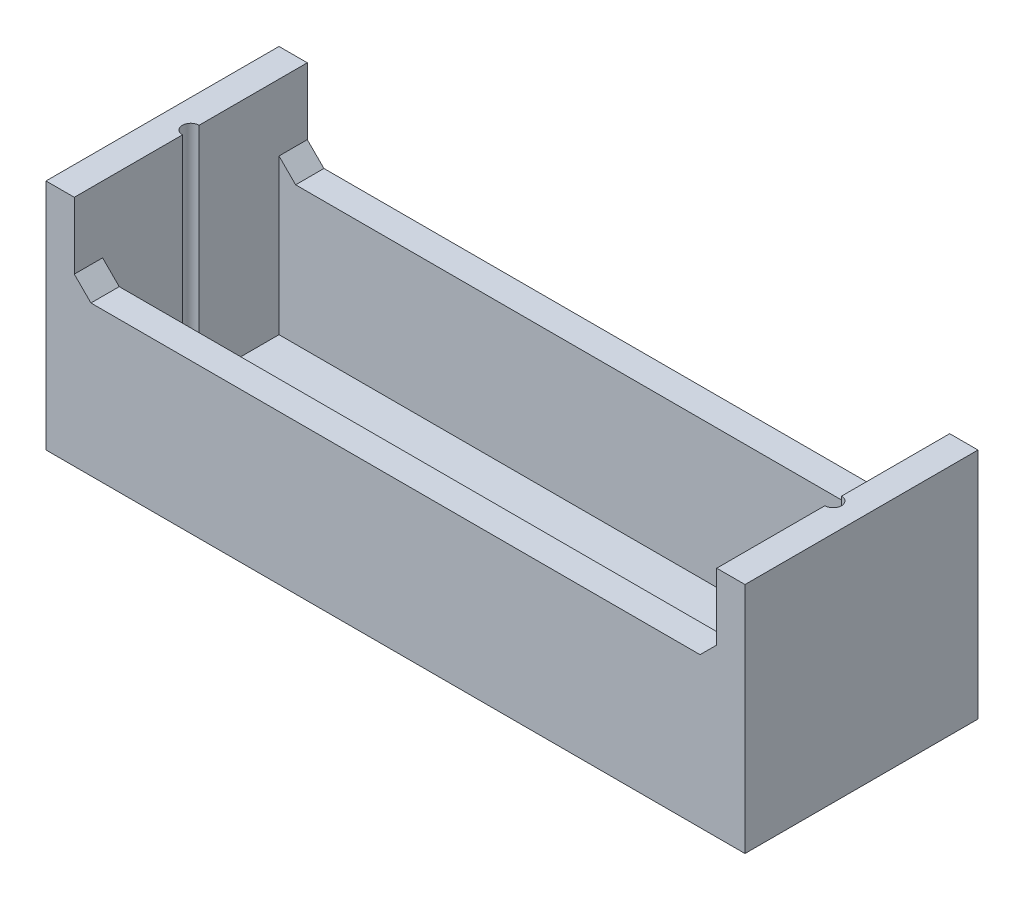
ISO-10303-21;
HEADER;
FILE_DESCRIPTION(('STEP AP214'),'2;1');
FILE_NAME('part.step','',(''),(''),'','','');
FILE_SCHEMA(('AUTOMOTIVE_DESIGN { 1 0 10303 214 1 1 1 1 }'));
ENDSEC;
DATA;
#1=APPLICATION_CONTEXT('core data for automotive mechanical design processes');
#2=APPLICATION_PROTOCOL_DEFINITION('international standard','automotive_design',2000,#1);
#3=PRODUCT_CONTEXT('',#1,'mechanical');
#4=PRODUCT('Part','Part','',(#3));
#5=PRODUCT_RELATED_PRODUCT_CATEGORY('part','',(#4));
#6=PRODUCT_DEFINITION_FORMATION('','',#4);
#7=PRODUCT_DEFINITION_CONTEXT('part definition',#1,'design');
#8=PRODUCT_DEFINITION('design','',#6,#7);
#9=PRODUCT_DEFINITION_SHAPE('','',#8);
#10=(LENGTH_UNIT() NAMED_UNIT(*) SI_UNIT(.MILLI.,.METRE.));
#11=(NAMED_UNIT(*) PLANE_ANGLE_UNIT() SI_UNIT($,.RADIAN.));
#12=(NAMED_UNIT(*) SI_UNIT($,.STERADIAN.) SOLID_ANGLE_UNIT());
#13=UNCERTAINTY_MEASURE_WITH_UNIT(LENGTH_MEASURE(1.E-05),#10,'distance_accuracy_value','');
#14=(GEOMETRIC_REPRESENTATION_CONTEXT(3) GLOBAL_UNCERTAINTY_ASSIGNED_CONTEXT((#13)) GLOBAL_UNIT_ASSIGNED_CONTEXT((#10,
#11,#12)) REPRESENTATION_CONTEXT('',''));
#15=CARTESIAN_POINT('',(0.,0.,0.));
#16=DIRECTION('',(0.,0.,1.));
#17=DIRECTION('',(1.,0.,0.));
#18=AXIS2_PLACEMENT_3D('',#15,#16,#17);
#19=CARTESIAN_POINT('',(-0.3,10.,2.));
#20=DIRECTION('',(1.,0.,0.));
#21=DIRECTION('',(0.,0.,-1.));
#22=AXIS2_PLACEMENT_3D('',#19,#20,#21);
#23=PLANE('',#22);
#24=DIRECTION('',(0.,-1.,0.));
#25=VECTOR('',#24,1.);
#26=CARTESIAN_POINT('',(-0.3,10.,-10.3));
#27=LINE('',#26,#25);
#28=CARTESIAN_POINT('',(-0.3,11.,-10.3));
#29=VERTEX_POINT('',#28);
#30=CARTESIAN_POINT('',(-0.3,1.7,-10.3));
#31=VERTEX_POINT('',#30);
#32=EDGE_CURVE('E274',#29,#31,#27,.T.);
#33=ORIENTED_EDGE('',*,*,#32,.F.);
#34=DIRECTION('',(0.,0.,-1.));
#35=VECTOR('',#34,1.);
#36=CARTESIAN_POINT('',(-0.3,11.,2.));
#37=LINE('',#36,#35);
#38=CARTESIAN_POINT('',(-0.3,11.,-12.));
#39=VERTEX_POINT('',#38);
#40=EDGE_CURVE('E344',#29,#39,#37,.T.);
#41=ORIENTED_EDGE('',*,*,#40,.T.);
#42=DIRECTION('',(0.,-1.,0.));
#43=VECTOR('',#42,1.);
#44=CARTESIAN_POINT('',(-0.3,15.,-12.));
#45=LINE('',#44,#43);
#46=CARTESIAN_POINT('',(-0.3,15.,-12.));
#47=VERTEX_POINT('',#46);
#48=EDGE_CURVE('E254',#47,#39,#45,.T.);
#49=ORIENTED_EDGE('',*,*,#48,.F.);
#50=DIRECTION('',(0.,0.,-1.));
#51=VECTOR('',#50,1.);
#52=CARTESIAN_POINT('',(-0.3,15.,-12.));
#53=LINE('',#52,#51);
#54=CARTESIAN_POINT('',(-0.299999999999999,15.,-5.5));
#55=VERTEX_POINT('',#54);
#56=EDGE_CURVE('E245',#55,#47,#53,.T.);
#57=ORIENTED_EDGE('',*,*,#56,.F.);
#58=DIRECTION('',(0.,1.,0.));
#59=VECTOR('',#58,1.);
#60=CARTESIAN_POINT('',(-0.3,0.285786437626903,-5.5));
#61=LINE('',#60,#59);
#62=CARTESIAN_POINT('',(-0.3,1.7,-5.5));
#63=VERTEX_POINT('',#62);
#64=EDGE_CURVE('E436',#63,#55,#61,.T.);
#65=ORIENTED_EDGE('',*,*,#64,.F.);
#66=DIRECTION('',(0.,0.,1.));
#67=VECTOR('',#66,1.);
#68=CARTESIAN_POINT('',(-0.3,1.7,0.));
#69=LINE('',#68,#67);
#70=EDGE_CURVE('E263',#31,#63,#69,.T.);
#71=ORIENTED_EDGE('',*,*,#70,.F.);
#72=EDGE_LOOP('',(#33,#41,#49,#57,#65,#71));
#73=FACE_BOUND('',#72,.T.);
#74=ADVANCED_FACE('F40',(#73),#23,.T.);
#75=CARTESIAN_POINT('',(38.3,10.,2.));
#76=DIRECTION('',(-1.,0.,0.));
#77=DIRECTION('',(0.,0.,1.));
#78=AXIS2_PLACEMENT_3D('',#75,#76,#77);
#79=PLANE('',#78);
#80=DIRECTION('',(0.,-1.,0.));
#81=VECTOR('',#80,1.);
#82=CARTESIAN_POINT('',(38.3,10.,0.3));
#83=LINE('',#82,#81);
#84=CARTESIAN_POINT('',(38.3,11.,0.3));
#85=VERTEX_POINT('',#84);
#86=CARTESIAN_POINT('',(38.3,1.7,0.3));
#87=VERTEX_POINT('',#86);
#88=EDGE_CURVE('E273',#85,#87,#83,.T.);
#89=ORIENTED_EDGE('',*,*,#88,.F.);
#90=DIRECTION('',(0.,0.,1.));
#91=VECTOR('',#90,1.);
#92=CARTESIAN_POINT('',(38.3,11.,2.));
#93=LINE('',#92,#91);
#94=CARTESIAN_POINT('',(38.3,11.,2.));
#95=VERTEX_POINT('',#94);
#96=EDGE_CURVE('E324',#85,#95,#93,.T.);
#97=ORIENTED_EDGE('',*,*,#96,.T.);
#98=DIRECTION('',(0.,-1.,0.));
#99=VECTOR('',#98,1.);
#100=CARTESIAN_POINT('',(38.3,15.,2.));
#101=LINE('',#100,#99);
#102=CARTESIAN_POINT('',(38.3,15.,2.));
#103=VERTEX_POINT('',#102);
#104=EDGE_CURVE('E227',#103,#95,#101,.T.);
#105=ORIENTED_EDGE('',*,*,#104,.F.);
#106=DIRECTION('',(0.,0.,1.));
#107=VECTOR('',#106,1.);
#108=CARTESIAN_POINT('',(38.3,15.,-12.));
#109=LINE('',#108,#107);
#110=CARTESIAN_POINT('',(38.3,15.,-4.5));
#111=VERTEX_POINT('',#110);
#112=EDGE_CURVE('E222',#111,#103,#109,.T.);
#113=ORIENTED_EDGE('',*,*,#112,.F.);
#114=DIRECTION('',(0.,1.,0.));
#115=VECTOR('',#114,1.);
#116=CARTESIAN_POINT('',(38.3,0.285786437626903,-4.5));
#117=LINE('',#116,#115);
#118=CARTESIAN_POINT('',(38.3,1.7,-4.5));
#119=VERTEX_POINT('',#118);
#120=EDGE_CURVE('E197',#119,#111,#117,.T.);
#121=ORIENTED_EDGE('',*,*,#120,.F.);
#122=DIRECTION('',(0.,0.,-1.));
#123=VECTOR('',#122,1.);
#124=CARTESIAN_POINT('',(38.3,1.7,0.));
#125=LINE('',#124,#123);
#126=EDGE_CURVE('E285',#87,#119,#125,.T.);
#127=ORIENTED_EDGE('',*,*,#126,.F.);
#128=EDGE_LOOP('',(#89,#97,#105,#113,#121,#127));
#129=FACE_BOUND('',#128,.T.);
#130=ADVANCED_FACE('F495',(#129),#79,.T.);
#131=CARTESIAN_POINT('',(0.,10.,0.));
#132=DIRECTION('',(0.,-1.,0.));
#133=DIRECTION('',(0.,0.,-1.));
#134=AXIS2_PLACEMENT_3D('',#131,#132,#133);
#135=PLANE('',#134);
#136=DIRECTION('',(-1.,0.,0.));
#137=VECTOR('',#136,1.);
#138=CARTESIAN_POINT('',(0.,10.,-10.3));
#139=LINE('',#138,#137);
#140=CARTESIAN_POINT('',(37.3,10.,-10.3));
#141=VERTEX_POINT('',#140);
#142=CARTESIAN_POINT('',(0.699999999999987,10.,-10.3));
#143=VERTEX_POINT('',#142);
#144=EDGE_CURVE('E279',#141,#143,#139,.T.);
#145=ORIENTED_EDGE('',*,*,#144,.F.);
#146=DIRECTION('',(0.,0.,-1.));
#147=VECTOR('',#146,1.);
#148=CARTESIAN_POINT('',(37.3,10.,0.));
#149=LINE('',#148,#147);
#150=CARTESIAN_POINT('',(37.3,10.,-12.));
#151=VERTEX_POINT('',#150);
#152=EDGE_CURVE('E341',#141,#151,#149,.T.);
#153=ORIENTED_EDGE('',*,*,#152,.T.);
#154=DIRECTION('',(-1.,0.,0.));
#155=VECTOR('',#154,1.);
#156=CARTESIAN_POINT('',(-2.,10.,-12.));
#157=LINE('',#156,#155);
#158=CARTESIAN_POINT('',(0.699999999999986,10.,-12.));
#159=VERTEX_POINT('',#158);
#160=EDGE_CURVE('E304',#151,#159,#157,.T.);
#161=ORIENTED_EDGE('',*,*,#160,.T.);
#162=DIRECTION('',(0.,0.,1.));
#163=VECTOR('',#162,1.);
#164=CARTESIAN_POINT('',(0.699999999999987,10.,0.));
#165=LINE('',#164,#163);
#166=EDGE_CURVE('E338',#159,#143,#165,.T.);
#167=ORIENTED_EDGE('',*,*,#166,.T.);
#168=EDGE_LOOP('',(#145,#153,#161,#167));
#169=FACE_BOUND('',#168,.T.);
#170=ADVANCED_FACE('F518',(#169),#135,.F.);
#171=DIRECTION('',(1.,0.,0.));
#172=VECTOR('',#171,1.);
#173=CARTESIAN_POINT('',(-2.,10.,2.));
#174=LINE('',#173,#172);
#175=CARTESIAN_POINT('',(0.699999999999986,10.,2.));
#176=VERTEX_POINT('',#175);
#177=CARTESIAN_POINT('',(37.3,10.,2.));
#178=VERTEX_POINT('',#177);
#179=EDGE_CURVE('E272',#176,#178,#174,.T.);
#180=ORIENTED_EDGE('',*,*,#179,.T.);
#181=DIRECTION('',(0.,0.,-1.));
#182=VECTOR('',#181,1.);
#183=CARTESIAN_POINT('',(37.3,10.,0.));
#184=LINE('',#183,#182);
#185=CARTESIAN_POINT('',(37.3,10.,0.3));
#186=VERTEX_POINT('',#185);
#187=EDGE_CURVE('E331',#178,#186,#184,.T.);
#188=ORIENTED_EDGE('',*,*,#187,.T.);
#189=DIRECTION('',(1.,0.,0.));
#190=VECTOR('',#189,1.);
#191=CARTESIAN_POINT('',(0.,10.,0.3));
#192=LINE('',#191,#190);
#193=CARTESIAN_POINT('',(0.699999999999987,10.,0.3));
#194=VERTEX_POINT('',#193);
#195=EDGE_CURVE('E294',#194,#186,#192,.T.);
#196=ORIENTED_EDGE('',*,*,#195,.F.);
#197=DIRECTION('',(0.,0.,1.));
#198=VECTOR('',#197,1.);
#199=CARTESIAN_POINT('',(0.699999999999987,10.,0.));
#200=LINE('',#199,#198);
#201=EDGE_CURVE('E328',#194,#176,#200,.T.);
#202=ORIENTED_EDGE('',*,*,#201,.T.);
#203=EDGE_LOOP('',(#180,#188,#196,#202));
#204=FACE_BOUND('',#203,.T.);
#205=ADVANCED_FACE('F488',(#204),#135,.F.);
#206=CARTESIAN_POINT('',(-2.,10.,2.));
#207=DIRECTION('',(1.,0.,0.));
#208=DIRECTION('',(0.,0.,-1.));
#209=AXIS2_PLACEMENT_3D('',#206,#207,#208);
#210=PLANE('',#209);
#211=DIRECTION('',(0.,-1.,0.));
#212=VECTOR('',#211,1.);
#213=CARTESIAN_POINT('',(-2.,10.,-12.));
#214=LINE('',#213,#212);
#215=CARTESIAN_POINT('',(-2.,15.,-12.));
#216=VERTEX_POINT('',#215);
#217=CARTESIAN_POINT('',(-2.,1.,-12.));
#218=VERTEX_POINT('',#217);
#219=EDGE_CURVE('E308',#216,#218,#214,.T.);
#220=ORIENTED_EDGE('',*,*,#219,.T.);
#221=DIRECTION('',(0.,0.,1.));
#222=VECTOR('',#221,1.);
#223=CARTESIAN_POINT('',(-2.,1.,2.));
#224=LINE('',#223,#222);
#225=CARTESIAN_POINT('',(-2.,1.,2.));
#226=VERTEX_POINT('',#225);
#227=EDGE_CURVE('E11',#218,#226,#224,.T.);
#228=ORIENTED_EDGE('',*,*,#227,.T.);
#229=DIRECTION('',(0.,-1.,0.));
#230=VECTOR('',#229,1.);
#231=CARTESIAN_POINT('',(-2.,10.,2.));
#232=LINE('',#231,#230);
#233=CARTESIAN_POINT('',(-2.,15.,2.));
#234=VERTEX_POINT('',#233);
#235=EDGE_CURVE('E317',#234,#226,#232,.T.);
#236=ORIENTED_EDGE('',*,*,#235,.F.);
#237=DIRECTION('',(0.,0.,1.));
#238=VECTOR('',#237,1.);
#239=CARTESIAN_POINT('',(-2.,15.,-12.));
#240=LINE('',#239,#238);
#241=EDGE_CURVE('E238',#216,#234,#240,.T.);
#242=ORIENTED_EDGE('',*,*,#241,.F.);
#243=EDGE_LOOP('',(#220,#228,#236,#242));
#244=FACE_BOUND('',#243,.T.);
#245=ADVANCED_FACE('F474',(#244),#210,.F.);
#246=CARTESIAN_POINT('',(-2.,10.,2.));
#247=DIRECTION('',(0.,0.,-1.));
#248=DIRECTION('',(-1.,0.,0.));
#249=AXIS2_PLACEMENT_3D('',#246,#247,#248);
#250=PLANE('',#249);
#251=ORIENTED_EDGE('',*,*,#235,.T.);
#252=DIRECTION('',(1.,0.,0.));
#253=VECTOR('',#252,1.);
#254=CARTESIAN_POINT('',(40.,1.,2.));
#255=LINE('',#254,#253);
#256=CARTESIAN_POINT('',(40.,1.,2.));
#257=VERTEX_POINT('',#256);
#258=EDGE_CURVE('E378',#226,#257,#255,.T.);
#259=ORIENTED_EDGE('',*,*,#258,.T.);
#260=DIRECTION('',(0.,-1.,0.));
#261=VECTOR('',#260,1.);
#262=CARTESIAN_POINT('',(40.,10.,2.));
#263=LINE('',#262,#261);
#264=CARTESIAN_POINT('',(40.,15.,2.));
#265=VERTEX_POINT('',#264);
#266=EDGE_CURVE('E314',#265,#257,#263,.T.);
#267=ORIENTED_EDGE('',*,*,#266,.F.);
#268=DIRECTION('',(1.,0.,0.));
#269=VECTOR('',#268,1.);
#270=CARTESIAN_POINT('',(40.,15.,2.));
#271=LINE('',#270,#269);
#272=EDGE_CURVE('E221',#103,#265,#271,.T.);
#273=ORIENTED_EDGE('',*,*,#272,.F.);
#274=ORIENTED_EDGE('',*,*,#104,.T.);
#275=DIRECTION('',(-0.707106781186543,-0.707106781186552,0.));
#276=VECTOR('',#275,1.);
#277=CARTESIAN_POINT('',(17.6500000000003,-9.65000000000001,2.));
#278=LINE('',#277,#276);
#279=EDGE_CURVE('E352',#95,#178,#278,.T.);
#280=ORIENTED_EDGE('',*,*,#279,.T.);
#281=ORIENTED_EDGE('',*,*,#179,.F.);
#282=DIRECTION('',(-0.707106781186543,0.707106781186552,0.));
#283=VECTOR('',#282,1.);
#284=CARTESIAN_POINT('',(-0.649999999999988,11.35,2.));
#285=LINE('',#284,#283);
#286=CARTESIAN_POINT('',(-0.299999999999998,11.,2.));
#287=VERTEX_POINT('',#286);
#288=EDGE_CURVE('E375',#176,#287,#285,.T.);
#289=ORIENTED_EDGE('',*,*,#288,.T.);
#290=DIRECTION('',(0.,-1.,0.));
#291=VECTOR('',#290,1.);
#292=CARTESIAN_POINT('',(-0.299999999999998,15.,2.));
#293=LINE('',#292,#291);
#294=CARTESIAN_POINT('',(-0.299999999999998,15.,2.));
#295=VERTEX_POINT('',#294);
#296=EDGE_CURVE('E258',#295,#287,#293,.T.);
#297=ORIENTED_EDGE('',*,*,#296,.F.);
#298=DIRECTION('',(1.,0.,0.));
#299=VECTOR('',#298,1.);
#300=CARTESIAN_POINT('',(-2.,15.,2.));
#301=LINE('',#300,#299);
#302=EDGE_CURVE('E242',#234,#295,#301,.T.);
#303=ORIENTED_EDGE('',*,*,#302,.F.);
#304=EDGE_LOOP('',(#251,#259,#267,#273,#274,#280,#281,#289,#297,#303));
#305=FACE_BOUND('',#304,.T.);
#306=ADVANCED_FACE('F429',(#305),#250,.F.);
#307=CARTESIAN_POINT('',(40.,10.,2.));
#308=DIRECTION('',(-1.,0.,0.));
#309=DIRECTION('',(0.,0.,1.));
#310=AXIS2_PLACEMENT_3D('',#307,#308,#309);
#311=PLANE('',#310);
#312=ORIENTED_EDGE('',*,*,#266,.T.);
#313=DIRECTION('',(0.,0.,-1.));
#314=VECTOR('',#313,1.);
#315=CARTESIAN_POINT('',(40.,1.,-12.));
#316=LINE('',#315,#314);
#317=CARTESIAN_POINT('',(40.,1.,-12.));
#318=VERTEX_POINT('',#317);
#319=EDGE_CURVE('E66',#257,#318,#316,.T.);
#320=ORIENTED_EDGE('',*,*,#319,.T.);
#321=DIRECTION('',(0.,-1.,0.));
#322=VECTOR('',#321,1.);
#323=CARTESIAN_POINT('',(40.,10.,-12.));
#324=LINE('',#323,#322);
#325=CARTESIAN_POINT('',(40.,15.,-12.));
#326=VERTEX_POINT('',#325);
#327=EDGE_CURVE('E311',#326,#318,#324,.T.);
#328=ORIENTED_EDGE('',*,*,#327,.F.);
#329=DIRECTION('',(0.,0.,-1.));
#330=VECTOR('',#329,1.);
#331=CARTESIAN_POINT('',(40.,15.,-12.));
#332=LINE('',#331,#330);
#333=EDGE_CURVE('E434',#265,#326,#332,.T.);
#334=ORIENTED_EDGE('',*,*,#333,.F.);
#335=EDGE_LOOP('',(#312,#320,#328,#334));
#336=FACE_BOUND('',#335,.T.);
#337=ADVANCED_FACE('F433',(#336),#311,.F.);
#338=CARTESIAN_POINT('',(-2.,10.,-12.));
#339=DIRECTION('',(0.,0.,1.));
#340=DIRECTION('',(1.,0.,0.));
#341=AXIS2_PLACEMENT_3D('',#338,#339,#340);
#342=PLANE('',#341);
#343=ORIENTED_EDGE('',*,*,#327,.T.);
#344=DIRECTION('',(-1.,0.,0.));
#345=VECTOR('',#344,1.);
#346=CARTESIAN_POINT('',(-2.,1.,-12.));
#347=LINE('',#346,#345);
#348=EDGE_CURVE('E51',#318,#218,#347,.T.);
#349=ORIENTED_EDGE('',*,*,#348,.T.);
#350=ORIENTED_EDGE('',*,*,#219,.F.);
#351=DIRECTION('',(-1.,0.,0.));
#352=VECTOR('',#351,1.);
#353=CARTESIAN_POINT('',(-2.,15.,-12.));
#354=LINE('',#353,#352);
#355=EDGE_CURVE('E250',#47,#216,#354,.T.);
#356=ORIENTED_EDGE('',*,*,#355,.F.);
#357=ORIENTED_EDGE('',*,*,#48,.T.);
#358=DIRECTION('',(0.707106781186543,-0.707106781186552,0.));
#359=VECTOR('',#358,1.);
#360=CARTESIAN_POINT('',(-0.649999999999988,11.35,-12.));
#361=LINE('',#360,#359);
#362=EDGE_CURVE('E365',#39,#159,#361,.T.);
#363=ORIENTED_EDGE('',*,*,#362,.T.);
#364=ORIENTED_EDGE('',*,*,#160,.F.);
#365=DIRECTION('',(0.707106781186543,0.707106781186552,0.));
#366=VECTOR('',#365,1.);
#367=CARTESIAN_POINT('',(17.6500000000003,-9.65000000000001,-12.));
#368=LINE('',#367,#366);
#369=CARTESIAN_POINT('',(38.3,11.,-12.));
#370=VERTEX_POINT('',#369);
#371=EDGE_CURVE('E362',#151,#370,#368,.T.);
#372=ORIENTED_EDGE('',*,*,#371,.T.);
#373=DIRECTION('',(0.,-1.,0.));
#374=VECTOR('',#373,1.);
#375=CARTESIAN_POINT('',(38.3,15.,-12.));
#376=LINE('',#375,#374);
#377=CARTESIAN_POINT('',(38.3,15.,-12.));
#378=VERTEX_POINT('',#377);
#379=EDGE_CURVE('E235',#378,#370,#376,.T.);
#380=ORIENTED_EDGE('',*,*,#379,.F.);
#381=DIRECTION('',(-1.,0.,0.));
#382=VECTOR('',#381,1.);
#383=CARTESIAN_POINT('',(40.,15.,-12.));
#384=LINE('',#383,#382);
#385=EDGE_CURVE('E218',#326,#378,#384,.T.);
#386=ORIENTED_EDGE('',*,*,#385,.F.);
#387=EDGE_LOOP('',(#343,#349,#350,#356,#357,#363,#364,#372,#380,#386));
#388=FACE_BOUND('',#387,.T.);
#389=ADVANCED_FACE('F472',(#388),#342,.F.);
#390=CARTESIAN_POINT('',(0.,0.,0.));
#391=DIRECTION('',(0.,-1.,0.));
#392=DIRECTION('',(0.,0.,-1.));
#393=AXIS2_PLACEMENT_3D('',#390,#391,#392);
#394=PLANE('',#393);
#395=DIRECTION('',(0.,0.,1.));
#396=VECTOR('',#395,1.);
#397=CARTESIAN_POINT('',(39.,0.,2.));
#398=LINE('',#397,#396);
#399=CARTESIAN_POINT('',(39.,0.,-11.));
#400=VERTEX_POINT('',#399);
#401=CARTESIAN_POINT('',(39.,0.,0.999999999999999));
#402=VERTEX_POINT('',#401);
#403=EDGE_CURVE('E388',#400,#402,#398,.T.);
#404=ORIENTED_EDGE('',*,*,#403,.T.);
#405=DIRECTION('',(-1.,0.,0.));
#406=VECTOR('',#405,1.);
#407=CARTESIAN_POINT('',(-2.,0.,0.999999999999999));
#408=LINE('',#407,#406);
#409=CARTESIAN_POINT('',(-0.999999999999999,0.,0.999999999999999));
#410=VERTEX_POINT('',#409);
#411=EDGE_CURVE('E391',#402,#410,#408,.T.);
#412=ORIENTED_EDGE('',*,*,#411,.T.);
#413=DIRECTION('',(0.,0.,-1.));
#414=VECTOR('',#413,1.);
#415=CARTESIAN_POINT('',(-0.999999999999999,0.,-12.));
#416=LINE('',#415,#414);
#417=CARTESIAN_POINT('',(-0.999999999999999,0.,-11.));
#418=VERTEX_POINT('',#417);
#419=EDGE_CURVE('E382',#410,#418,#416,.T.);
#420=ORIENTED_EDGE('',*,*,#419,.T.);
#421=DIRECTION('',(1.,0.,0.));
#422=VECTOR('',#421,1.);
#423=CARTESIAN_POINT('',(40.,0.,-11.));
#424=LINE('',#423,#422);
#425=EDGE_CURVE('E385',#418,#400,#424,.T.);
#426=ORIENTED_EDGE('',*,*,#425,.T.);
#427=EDGE_LOOP('',(#404,#412,#420,#426));
#428=FACE_BOUND('',#427,.T.);
#429=ADVANCED_FACE('F421',(#428),#394,.T.);
#430=ORIENTED_EDGE('',*,*,#296,.T.);
#431=DIRECTION('',(0.,0.,-1.));
#432=VECTOR('',#431,1.);
#433=CARTESIAN_POINT('',(-0.3,11.,2.));
#434=LINE('',#433,#432);
#435=CARTESIAN_POINT('',(-0.3,11.,0.3));
#436=VERTEX_POINT('',#435);
#437=EDGE_CURVE('E348',#287,#436,#434,.T.);
#438=ORIENTED_EDGE('',*,*,#437,.T.);
#439=DIRECTION('',(0.,-1.,0.));
#440=VECTOR('',#439,1.);
#441=CARTESIAN_POINT('',(-0.3,10.,0.3));
#442=LINE('',#441,#440);
#443=CARTESIAN_POINT('',(-0.3,1.7,0.3));
#444=VERTEX_POINT('',#443);
#445=EDGE_CURVE('E268',#436,#444,#442,.T.);
#446=ORIENTED_EDGE('',*,*,#445,.T.);
#447=CARTESIAN_POINT('',(-0.3,1.7,-4.5));
#448=VERTEX_POINT('',#447);
#449=EDGE_CURVE('E262',#448,#444,#69,.T.);
#450=ORIENTED_EDGE('',*,*,#449,.F.);
#451=DIRECTION('',(0.,1.,0.));
#452=VECTOR('',#451,1.);
#453=CARTESIAN_POINT('',(-0.3,0.285786437626903,-4.5));
#454=LINE('',#453,#452);
#455=CARTESIAN_POINT('',(-0.299999999999999,15.,-4.5));
#456=VERTEX_POINT('',#455);
#457=EDGE_CURVE('E439',#456,#448,#454,.F.);
#458=ORIENTED_EDGE('',*,*,#457,.F.);
#459=EDGE_CURVE('E246',#295,#456,#53,.T.);
#460=ORIENTED_EDGE('',*,*,#459,.F.);
#461=EDGE_LOOP('',(#430,#438,#446,#450,#458,#460));
#462=FACE_BOUND('',#461,.T.);
#463=ADVANCED_FACE('F459',(#462),#23,.T.);
#464=CARTESIAN_POINT('',(-2.,10.,0.3));
#465=DIRECTION('',(0.,0.,-1.));
#466=DIRECTION('',(-1.,0.,0.));
#467=AXIS2_PLACEMENT_3D('',#464,#465,#466);
#468=PLANE('',#467);
#469=DIRECTION('',(1.,0.,0.));
#470=VECTOR('',#469,1.);
#471=CARTESIAN_POINT('',(0.,1.7,0.3));
#472=LINE('',#471,#470);
#473=EDGE_CURVE('E267',#444,#87,#472,.T.);
#474=ORIENTED_EDGE('',*,*,#473,.F.);
#475=ORIENTED_EDGE('',*,*,#445,.F.);
#476=DIRECTION('',(0.707106781186543,-0.707106781186552,0.));
#477=VECTOR('',#476,1.);
#478=CARTESIAN_POINT('',(-0.3,11.,0.3));
#479=LINE('',#478,#477);
#480=EDGE_CURVE('E372',#436,#194,#479,.T.);
#481=ORIENTED_EDGE('',*,*,#480,.T.);
#482=ORIENTED_EDGE('',*,*,#195,.T.);
#483=DIRECTION('',(0.707106781186543,0.707106781186552,0.));
#484=VECTOR('',#483,1.);
#485=CARTESIAN_POINT('',(38.3,11.,0.3));
#486=LINE('',#485,#484);
#487=EDGE_CURVE('E355',#186,#85,#486,.T.);
#488=ORIENTED_EDGE('',*,*,#487,.T.);
#489=ORIENTED_EDGE('',*,*,#88,.T.);
#490=EDGE_LOOP('',(#474,#475,#481,#482,#488,#489));
#491=FACE_BOUND('',#490,.T.);
#492=ADVANCED_FACE('F485',(#491),#468,.T.);
#493=ORIENTED_EDGE('',*,*,#379,.T.);
#494=DIRECTION('',(0.,0.,1.));
#495=VECTOR('',#494,1.);
#496=CARTESIAN_POINT('',(38.3,11.,2.));
#497=LINE('',#496,#495);
#498=CARTESIAN_POINT('',(38.3,11.,-10.3));
#499=VERTEX_POINT('',#498);
#500=EDGE_CURVE('E334',#370,#499,#497,.T.);
#501=ORIENTED_EDGE('',*,*,#500,.T.);
#502=DIRECTION('',(0.,-1.,0.));
#503=VECTOR('',#502,1.);
#504=CARTESIAN_POINT('',(38.3,10.,-10.3));
#505=LINE('',#504,#503);
#506=CARTESIAN_POINT('',(38.3,1.7,-10.3));
#507=VERTEX_POINT('',#506);
#508=EDGE_CURVE('E278',#499,#507,#505,.T.);
#509=ORIENTED_EDGE('',*,*,#508,.T.);
#510=CARTESIAN_POINT('',(38.3,1.7,-5.5));
#511=VERTEX_POINT('',#510);
#512=EDGE_CURVE('E211',#511,#507,#125,.T.);
#513=ORIENTED_EDGE('',*,*,#512,.F.);
#514=DIRECTION('',(0.,1.,0.));
#515=VECTOR('',#514,1.);
#516=CARTESIAN_POINT('',(38.3,0.285786437626903,-5.5));
#517=LINE('',#516,#515);
#518=CARTESIAN_POINT('',(38.3,15.,-5.5));
#519=VERTEX_POINT('',#518);
#520=EDGE_CURVE('E194',#519,#511,#517,.F.);
#521=ORIENTED_EDGE('',*,*,#520,.F.);
#522=EDGE_CURVE('E209',#378,#519,#109,.T.);
#523=ORIENTED_EDGE('',*,*,#522,.F.);
#524=EDGE_LOOP('',(#493,#501,#509,#513,#521,#523));
#525=FACE_BOUND('',#524,.T.);
#526=ADVANCED_FACE('F208',(#525),#79,.T.);
#527=CARTESIAN_POINT('',(-2.,10.,-10.3));
#528=DIRECTION('',(0.,0.,1.));
#529=DIRECTION('',(1.,0.,0.));
#530=AXIS2_PLACEMENT_3D('',#527,#528,#529);
#531=PLANE('',#530);
#532=DIRECTION('',(-1.,0.,0.));
#533=VECTOR('',#532,1.);
#534=CARTESIAN_POINT('',(0.,1.7,-10.3));
#535=LINE('',#534,#533);
#536=EDGE_CURVE('E289',#507,#31,#535,.T.);
#537=ORIENTED_EDGE('',*,*,#536,.F.);
#538=ORIENTED_EDGE('',*,*,#508,.F.);
#539=DIRECTION('',(-0.707106781186543,-0.707106781186552,0.));
#540=VECTOR('',#539,1.);
#541=CARTESIAN_POINT('',(38.3,11.,-10.3));
#542=LINE('',#541,#540);
#543=EDGE_CURVE('E359',#499,#141,#542,.T.);
#544=ORIENTED_EDGE('',*,*,#543,.T.);
#545=ORIENTED_EDGE('',*,*,#144,.T.);
#546=DIRECTION('',(-0.707106781186543,0.707106781186552,0.));
#547=VECTOR('',#546,1.);
#548=CARTESIAN_POINT('',(-0.3,11.,-10.3));
#549=LINE('',#548,#547);
#550=EDGE_CURVE('E368',#143,#29,#549,.T.);
#551=ORIENTED_EDGE('',*,*,#550,.T.);
#552=ORIENTED_EDGE('',*,*,#32,.T.);
#553=EDGE_LOOP('',(#537,#538,#544,#545,#551,#552));
#554=FACE_BOUND('',#553,.T.);
#555=ADVANCED_FACE('F501',(#554),#531,.T.);
#556=CARTESIAN_POINT('',(0.,1.7,0.));
#557=DIRECTION('',(0.,-1.,0.));
#558=DIRECTION('',(0.,0.,-1.));
#559=AXIS2_PLACEMENT_3D('',#556,#557,#558);
#560=PLANE('',#559);
#561=ORIENTED_EDGE('',*,*,#70,.T.);
#562=CARTESIAN_POINT('',(-0.3,1.7,-5.));
#563=DIRECTION('',(0.,-1.,0.));
#564=DIRECTION('',(0.,0.,-1.));
#565=AXIS2_PLACEMENT_3D('',#562,#563,#564);
#566=CIRCLE('',#565,0.5);
#567=EDGE_CURVE('E213',#63,#448,#566,.F.);
#568=ORIENTED_EDGE('',*,*,#567,.T.);
#569=ORIENTED_EDGE('',*,*,#449,.T.);
#570=ORIENTED_EDGE('',*,*,#473,.T.);
#571=ORIENTED_EDGE('',*,*,#126,.T.);
#572=CARTESIAN_POINT('',(38.3,1.7,-5.));
#573=DIRECTION('',(0.,-1.,0.));
#574=DIRECTION('',(0.,0.,-1.));
#575=AXIS2_PLACEMENT_3D('',#572,#573,#574);
#576=CIRCLE('',#575,0.499999999999999);
#577=EDGE_CURVE('E202',#119,#511,#576,.F.);
#578=ORIENTED_EDGE('',*,*,#577,.T.);
#579=ORIENTED_EDGE('',*,*,#512,.T.);
#580=ORIENTED_EDGE('',*,*,#536,.T.);
#581=EDGE_LOOP('',(#561,#568,#569,#570,#571,#578,#579,#580));
#582=FACE_BOUND('',#581,.T.);
#583=ADVANCED_FACE('F452',(#582),#560,.F.);
#584=CARTESIAN_POINT('',(0.,15.,0.));
#585=DIRECTION('',(0.,1.,0.));
#586=DIRECTION('',(0.,0.,1.));
#587=AXIS2_PLACEMENT_3D('',#584,#585,#586);
#588=PLANE('',#587);
#589=CARTESIAN_POINT('',(-0.3,15.,-5.));
#590=DIRECTION('',(0.,1.,0.));
#591=DIRECTION('',(0.,0.,1.));
#592=AXIS2_PLACEMENT_3D('',#589,#590,#591);
#593=CIRCLE('',#592,0.5);
#594=EDGE_CURVE('E321',#55,#456,#593,.T.);
#595=ORIENTED_EDGE('',*,*,#594,.F.);
#596=ORIENTED_EDGE('',*,*,#56,.T.);
#597=ORIENTED_EDGE('',*,*,#355,.T.);
#598=ORIENTED_EDGE('',*,*,#241,.T.);
#599=ORIENTED_EDGE('',*,*,#302,.T.);
#600=ORIENTED_EDGE('',*,*,#459,.T.);
#601=EDGE_LOOP('',(#595,#596,#597,#598,#599,#600));
#602=FACE_BOUND('',#601,.T.);
#603=ADVANCED_FACE('F467',(#602),#588,.T.);
#604=CARTESIAN_POINT('',(0.,15.,0.));
#605=DIRECTION('',(0.,-1.,0.));
#606=DIRECTION('',(0.,0.,-1.));
#607=AXIS2_PLACEMENT_3D('',#604,#605,#606);
#608=PLANE('',#607);
#609=ORIENTED_EDGE('',*,*,#522,.T.);
#610=CARTESIAN_POINT('',(38.3,15.,-5.));
#611=DIRECTION('',(0.,1.,0.));
#612=DIRECTION('',(0.,0.,1.));
#613=AXIS2_PLACEMENT_3D('',#610,#611,#612);
#614=CIRCLE('',#613,0.499999999999999);
#615=EDGE_CURVE('E191',#111,#519,#614,.T.);
#616=ORIENTED_EDGE('',*,*,#615,.F.);
#617=ORIENTED_EDGE('',*,*,#112,.T.);
#618=ORIENTED_EDGE('',*,*,#272,.T.);
#619=ORIENTED_EDGE('',*,*,#333,.T.);
#620=ORIENTED_EDGE('',*,*,#385,.T.);
#621=EDGE_LOOP('',(#609,#616,#617,#618,#619,#620));
#622=FACE_BOUND('',#621,.T.);
#623=ADVANCED_FACE('F215',(#622),#608,.F.);
#624=CARTESIAN_POINT('',(38.3,0.285786437626903,-5.));
#625=DIRECTION('',(0.,1.,0.));
#626=DIRECTION('',(0.,0.,1.));
#627=AXIS2_PLACEMENT_3D('',#624,#625,#626);
#628=CYLINDRICAL_SURFACE('',#627,0.499999999999999);
#629=ORIENTED_EDGE('',*,*,#120,.T.);
#630=ORIENTED_EDGE('',*,*,#615,.T.);
#631=ORIENTED_EDGE('',*,*,#520,.T.);
#632=ORIENTED_EDGE('',*,*,#577,.F.);
#633=EDGE_LOOP('',(#629,#630,#631,#632));
#634=FACE_BOUND('',#633,.T.);
#635=ADVANCED_FACE('F193',(#634),#628,.F.);
#636=CARTESIAN_POINT('',(-0.3,0.285786437626903,-5.));
#637=DIRECTION('',(0.,1.,0.));
#638=DIRECTION('',(0.,0.,1.));
#639=AXIS2_PLACEMENT_3D('',#636,#637,#638);
#640=CYLINDRICAL_SURFACE('',#639,0.5);
#641=ORIENTED_EDGE('',*,*,#64,.T.);
#642=ORIENTED_EDGE('',*,*,#594,.T.);
#643=ORIENTED_EDGE('',*,*,#457,.T.);
#644=ORIENTED_EDGE('',*,*,#567,.F.);
#645=EDGE_LOOP('',(#641,#642,#643,#644));
#646=FACE_BOUND('',#645,.T.);
#647=ADVANCED_FACE('F503',(#646),#640,.F.);
#648=CARTESIAN_POINT('',(38.3,11.,2.));
#649=DIRECTION('',(0.707106781186552,-0.707106781186543,0.));
#650=DIRECTION('',(0.,0.,1.));
#651=AXIS2_PLACEMENT_3D('',#648,#649,#650);
#652=PLANE('',#651);
#653=ORIENTED_EDGE('',*,*,#487,.F.);
#654=ORIENTED_EDGE('',*,*,#187,.F.);
#655=ORIENTED_EDGE('',*,*,#279,.F.);
#656=ORIENTED_EDGE('',*,*,#96,.F.);
#657=EDGE_LOOP('',(#653,#654,#655,#656));
#658=FACE_BOUND('',#657,.T.);
#659=ADVANCED_FACE('F491',(#658),#652,.F.);
#660=CARTESIAN_POINT('',(38.3,11.,2.));
#661=DIRECTION('',(0.707106781186552,-0.707106781186543,0.));
#662=DIRECTION('',(0.,0.,1.));
#663=AXIS2_PLACEMENT_3D('',#660,#661,#662);
#664=PLANE('',#663);
#665=ORIENTED_EDGE('',*,*,#371,.F.);
#666=ORIENTED_EDGE('',*,*,#152,.F.);
#667=ORIENTED_EDGE('',*,*,#543,.F.);
#668=ORIENTED_EDGE('',*,*,#500,.F.);
#669=EDGE_LOOP('',(#665,#666,#667,#668));
#670=FACE_BOUND('',#669,.T.);
#671=ADVANCED_FACE('F510',(#670),#664,.F.);
#672=CARTESIAN_POINT('',(-0.3,11.,2.));
#673=DIRECTION('',(-0.707106781186552,-0.707106781186543,0.));
#674=DIRECTION('',(0.,0.,-1.));
#675=AXIS2_PLACEMENT_3D('',#672,#673,#674);
#676=PLANE('',#675);
#677=ORIENTED_EDGE('',*,*,#550,.F.);
#678=ORIENTED_EDGE('',*,*,#166,.F.);
#679=ORIENTED_EDGE('',*,*,#362,.F.);
#680=ORIENTED_EDGE('',*,*,#40,.F.);
#681=EDGE_LOOP('',(#677,#678,#679,#680));
#682=FACE_BOUND('',#681,.T.);
#683=ADVANCED_FACE('F550',(#682),#676,.F.);
#684=CARTESIAN_POINT('',(-0.3,11.,2.));
#685=DIRECTION('',(-0.707106781186552,-0.707106781186543,0.));
#686=DIRECTION('',(0.,0.,-1.));
#687=AXIS2_PLACEMENT_3D('',#684,#685,#686);
#688=PLANE('',#687);
#689=ORIENTED_EDGE('',*,*,#288,.F.);
#690=ORIENTED_EDGE('',*,*,#201,.F.);
#691=ORIENTED_EDGE('',*,*,#480,.F.);
#692=ORIENTED_EDGE('',*,*,#437,.F.);
#693=EDGE_LOOP('',(#689,#690,#691,#692));
#694=FACE_BOUND('',#693,.T.);
#695=ADVANCED_FACE('F481',(#694),#688,.F.);
#696=CARTESIAN_POINT('',(-2.,1.,-12.));
#697=DIRECTION('',(0.,-0.707106781186547,-0.707106781186547));
#698=DIRECTION('',(1.,0.,0.));
#699=AXIS2_PLACEMENT_3D('',#696,#697,#698);
#700=PLANE('',#699);
#701=DIRECTION('',(-0.577350269189626,-0.577350269189626,0.577350269189626));
#702=VECTOR('',#701,1.);
#703=CARTESIAN_POINT('',(26.,-13.,2.));
#704=LINE('',#703,#702);
#705=EDGE_CURVE('E404',#400,#318,#704,.F.);
#706=ORIENTED_EDGE('',*,*,#705,.F.);
#707=ORIENTED_EDGE('',*,*,#425,.F.);
#708=DIRECTION('',(0.577350269189626,-0.577350269189626,0.577350269189626));
#709=VECTOR('',#708,1.);
#710=CARTESIAN_POINT('',(2.66666666666667,-3.66666666666667,-7.33333333333333));
#711=LINE('',#710,#709);
#712=EDGE_CURVE('E45',#218,#418,#711,.T.);
#713=ORIENTED_EDGE('',*,*,#712,.F.);
#714=ORIENTED_EDGE('',*,*,#348,.F.);
#715=EDGE_LOOP('',(#706,#707,#713,#714));
#716=FACE_BOUND('',#715,.T.);
#717=ADVANCED_FACE('F43',(#716),#700,.T.);
#718=CARTESIAN_POINT('',(-2.,1.,2.));
#719=DIRECTION('',(-0.707106781186547,-0.707106781186547,0.));
#720=DIRECTION('',(0.,0.,-1.));
#721=AXIS2_PLACEMENT_3D('',#718,#719,#720);
#722=PLANE('',#721);
#723=ORIENTED_EDGE('',*,*,#712,.T.);
#724=ORIENTED_EDGE('',*,*,#419,.F.);
#725=DIRECTION('',(-0.577350269189626,0.577350269189626,0.577350269189626));
#726=VECTOR('',#725,1.);
#727=CARTESIAN_POINT('',(-2.,1.,2.));
#728=LINE('',#727,#726);
#729=EDGE_CURVE('E402',#226,#410,#728,.F.);
#730=ORIENTED_EDGE('',*,*,#729,.F.);
#731=ORIENTED_EDGE('',*,*,#227,.F.);
#732=EDGE_LOOP('',(#723,#724,#730,#731));
#733=FACE_BOUND('',#732,.T.);
#734=ADVANCED_FACE('F416',(#733),#722,.T.);
#735=CARTESIAN_POINT('',(40.,1.,2.));
#736=DIRECTION('',(0.707106781186547,-0.707106781186547,0.));
#737=DIRECTION('',(0.,0.,1.));
#738=AXIS2_PLACEMENT_3D('',#735,#736,#737);
#739=PLANE('',#738);
#740=ORIENTED_EDGE('',*,*,#705,.T.);
#741=ORIENTED_EDGE('',*,*,#319,.F.);
#742=DIRECTION('',(-0.577350269189626,-0.577350269189626,-0.577350269189626));
#743=VECTOR('',#742,1.);
#744=CARTESIAN_POINT('',(40.,1.,2.));
#745=LINE('',#744,#743);
#746=EDGE_CURVE('E399',#402,#257,#745,.F.);
#747=ORIENTED_EDGE('',*,*,#746,.F.);
#748=ORIENTED_EDGE('',*,*,#403,.F.);
#749=EDGE_LOOP('',(#740,#741,#747,#748));
#750=FACE_BOUND('',#749,.T.);
#751=ADVANCED_FACE('F427',(#750),#739,.T.);
#752=CARTESIAN_POINT('',(-2.,1.,2.));
#753=DIRECTION('',(0.,-0.707106781186547,0.707106781186547));
#754=DIRECTION('',(-1.,0.,0.));
#755=AXIS2_PLACEMENT_3D('',#752,#753,#754);
#756=PLANE('',#755);
#757=ORIENTED_EDGE('',*,*,#729,.T.);
#758=ORIENTED_EDGE('',*,*,#411,.F.);
#759=ORIENTED_EDGE('',*,*,#746,.T.);
#760=ORIENTED_EDGE('',*,*,#258,.F.);
#761=EDGE_LOOP('',(#757,#758,#759,#760));
#762=FACE_BOUND('',#761,.T.);
#763=ADVANCED_FACE('F425',(#762),#756,.T.);
#764=CLOSED_SHELL('',(#74,#130,#170,#205,#245,#306,#337,#389,#429,#463,#492,#526,#555,#583,#603,
#623,#635,#647,#659,#671,#683,#695,#717,#734,#751,#763));
#765=MANIFOLD_SOLID_BREP('B2',#764);
#766=ADVANCED_BREP_SHAPE_REPRESENTATION('',(#18,#765),#14);
#767=SHAPE_DEFINITION_REPRESENTATION(#9,#766);
ENDSEC;
END-ISO-10303-21;
